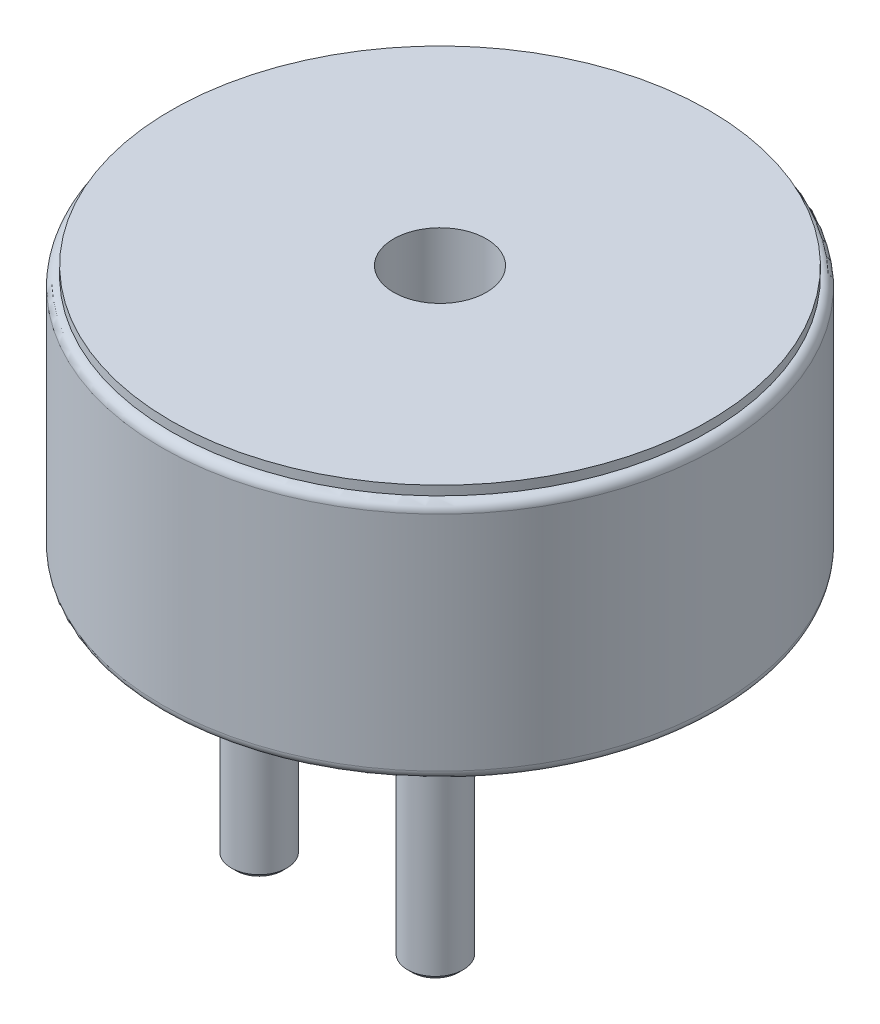
ISO-10303-21;
HEADER;
FILE_DESCRIPTION(('STEP AP214'),'2;1');
FILE_NAME('part.step','',(''),(''),'','','');
FILE_SCHEMA(('AUTOMOTIVE_DESIGN { 1 0 10303 214 1 1 1 1 }'));
ENDSEC;
DATA;
#1=APPLICATION_CONTEXT('core data for automotive mechanical design processes');
#2=APPLICATION_PROTOCOL_DEFINITION('international standard','automotive_design',2000,#1);
#3=PRODUCT_CONTEXT('',#1,'mechanical');
#4=PRODUCT('Part','Part','',(#3));
#5=PRODUCT_RELATED_PRODUCT_CATEGORY('part','',(#4));
#6=PRODUCT_DEFINITION_FORMATION('','',#4);
#7=PRODUCT_DEFINITION_CONTEXT('part definition',#1,'design');
#8=PRODUCT_DEFINITION('design','',#6,#7);
#9=PRODUCT_DEFINITION_SHAPE('','',#8);
#10=(LENGTH_UNIT() NAMED_UNIT(*) SI_UNIT(.MILLI.,.METRE.));
#11=(NAMED_UNIT(*) PLANE_ANGLE_UNIT() SI_UNIT($,.RADIAN.));
#12=(NAMED_UNIT(*) SI_UNIT($,.STERADIAN.) SOLID_ANGLE_UNIT());
#13=UNCERTAINTY_MEASURE_WITH_UNIT(LENGTH_MEASURE(1.E-05),#10,'distance_accuracy_value','');
#14=(GEOMETRIC_REPRESENTATION_CONTEXT(3) GLOBAL_UNCERTAINTY_ASSIGNED_CONTEXT((#13)) GLOBAL_UNIT_ASSIGNED_CONTEXT((#10,
#11,#12)) REPRESENTATION_CONTEXT('',''));
#15=CARTESIAN_POINT('',(0.,0.,0.));
#16=DIRECTION('',(0.,0.,1.));
#17=DIRECTION('',(1.,0.,0.));
#18=AXIS2_PLACEMENT_3D('',#15,#16,#17);
#19=CARTESIAN_POINT('',(0.,0.,0.));
#20=DIRECTION('',(0.,1.,0.));
#21=DIRECTION('',(0.,0.,1.));
#22=AXIS2_PLACEMENT_3D('',#19,#20,#21);
#23=PLANE('',#22);
#24=CARTESIAN_POINT('',(-0.95,0.,1.));
#25=DIRECTION('',(0.,1.,0.));
#26=DIRECTION('',(0.,0.,1.));
#27=AXIS2_PLACEMENT_3D('',#24,#25,#26);
#28=CIRCLE('',#27,0.3);
#29=CARTESIAN_POINT('',(-0.95,0.,1.3));
#30=VERTEX_POINT('',#29);
#31=EDGE_CURVE('E54',#30,#30,#28,.F.);
#32=ORIENTED_EDGE('',*,*,#31,.F.);
#33=EDGE_LOOP('',(#32));
#34=FACE_BOUND('',#33,.T.);
#35=CARTESIAN_POINT('',(0.,0.,0.));
#36=DIRECTION('',(0.,1.,0.));
#37=DIRECTION('',(0.,0.,1.));
#38=AXIS2_PLACEMENT_3D('',#35,#36,#37);
#39=CIRCLE('',#38,2.9);
#40=CARTESIAN_POINT('',(0.,0.,2.9));
#41=VERTEX_POINT('',#40);
#42=EDGE_CURVE('E57',#41,#41,#39,.F.);
#43=ORIENTED_EDGE('',*,*,#42,.T.);
#44=EDGE_LOOP('',(#43));
#45=FACE_BOUND('',#44,.T.);
#46=CARTESIAN_POINT('',(0.95,0.,1.));
#47=DIRECTION('',(0.,1.,0.));
#48=DIRECTION('',(0.,0.,1.));
#49=AXIS2_PLACEMENT_3D('',#46,#47,#48);
#50=CIRCLE('',#49,0.3);
#51=CARTESIAN_POINT('',(0.95,0.,1.3));
#52=VERTEX_POINT('',#51);
#53=EDGE_CURVE('E51',#52,#52,#50,.F.);
#54=ORIENTED_EDGE('',*,*,#53,.F.);
#55=EDGE_LOOP('',(#54));
#56=FACE_BOUND('',#55,.T.);
#57=ADVANCED_FACE('F31',(#34,#45,#56),#23,.F.);
#58=CARTESIAN_POINT('',(0.,2.6,0.));
#59=DIRECTION('',(0.,-1.,0.));
#60=DIRECTION('',(0.,0.,-1.));
#61=AXIS2_PLACEMENT_3D('',#58,#59,#60);
#62=CYLINDRICAL_SURFACE('',#61,3.);
#63=CARTESIAN_POINT('',(0.,2.5,0.));
#64=DIRECTION('',(0.,1.,0.));
#65=DIRECTION('',(0.,0.,1.));
#66=AXIS2_PLACEMENT_3D('',#63,#64,#65);
#67=CIRCLE('',#66,3.);
#68=CARTESIAN_POINT('',(0.,2.5,3.));
#69=VERTEX_POINT('',#68);
#70=EDGE_CURVE('E60',#69,#69,#67,.F.);
#71=ORIENTED_EDGE('',*,*,#70,.T.);
#72=EDGE_LOOP('',(#71));
#73=FACE_BOUND('',#72,.T.);
#74=CARTESIAN_POINT('',(0.,0.0999999999999998,0.));
#75=DIRECTION('',(0.,1.,0.));
#76=DIRECTION('',(0.,0.,1.));
#77=AXIS2_PLACEMENT_3D('',#74,#75,#76);
#78=CIRCLE('',#77,3.);
#79=CARTESIAN_POINT('',(0.,0.0999999999999998,3.));
#80=VERTEX_POINT('',#79);
#81=EDGE_CURVE('E63',#80,#80,#78,.T.);
#82=ORIENTED_EDGE('',*,*,#81,.T.);
#83=EDGE_LOOP('',(#82));
#84=FACE_BOUND('',#83,.T.);
#85=ADVANCED_FACE('F102',(#73,#84),#62,.T.);
#86=CARTESIAN_POINT('',(0.,2.5,0.));
#87=DIRECTION('',(0.,1.,0.));
#88=DIRECTION('',(0.,0.,1.));
#89=AXIS2_PLACEMENT_3D('',#86,#87,#88);
#90=TOROIDAL_SURFACE('',#89,2.9,0.1);
#91=ORIENTED_EDGE('',*,*,#70,.F.);
#92=EDGE_LOOP('',(#91));
#93=FACE_BOUND('',#92,.T.);
#94=CARTESIAN_POINT('',(0.,2.6,0.));
#95=DIRECTION('',(0.,1.,0.));
#96=DIRECTION('',(0.,0.,1.));
#97=AXIS2_PLACEMENT_3D('',#94,#95,#96);
#98=CIRCLE('',#97,2.9);
#99=CARTESIAN_POINT('',(0.,2.6,2.9));
#100=VERTEX_POINT('',#99);
#101=EDGE_CURVE('E66',#100,#100,#98,.T.);
#102=ORIENTED_EDGE('',*,*,#101,.F.);
#103=EDGE_LOOP('',(#102));
#104=FACE_BOUND('',#103,.T.);
#105=ADVANCED_FACE('F100',(#93,#104),#90,.T.);
#106=CARTESIAN_POINT('',(0.,0.0999999999999998,0.));
#107=DIRECTION('',(0.,1.,0.));
#108=DIRECTION('',(0.,0.,1.));
#109=AXIS2_PLACEMENT_3D('',#106,#107,#108);
#110=TOROIDAL_SURFACE('',#109,2.9,0.1);
#111=ORIENTED_EDGE('',*,*,#42,.F.);
#112=EDGE_LOOP('',(#111));
#113=FACE_BOUND('',#112,.T.);
#114=ORIENTED_EDGE('',*,*,#81,.F.);
#115=EDGE_LOOP('',(#114));
#116=FACE_BOUND('',#115,.T.);
#117=ADVANCED_FACE('F96',(#113,#116),#110,.T.);
#118=CARTESIAN_POINT('',(0.,2.7,0.));
#119=DIRECTION('',(0.,-1.,0.));
#120=DIRECTION('',(0.,0.,-1.));
#121=AXIS2_PLACEMENT_3D('',#118,#119,#120);
#122=CYLINDRICAL_SURFACE('',#121,2.9);
#123=CARTESIAN_POINT('',(0.,2.7,0.));
#124=DIRECTION('',(0.,1.,0.));
#125=DIRECTION('',(0.,0.,1.));
#126=AXIS2_PLACEMENT_3D('',#123,#124,#125);
#127=CIRCLE('',#126,2.9);
#128=CARTESIAN_POINT('',(0.,2.7,2.9));
#129=VERTEX_POINT('',#128);
#130=EDGE_CURVE('E69',#129,#129,#127,.T.);
#131=ORIENTED_EDGE('',*,*,#130,.F.);
#132=EDGE_LOOP('',(#131));
#133=FACE_BOUND('',#132,.T.);
#134=ORIENTED_EDGE('',*,*,#101,.T.);
#135=EDGE_LOOP('',(#134));
#136=FACE_BOUND('',#135,.T.);
#137=ADVANCED_FACE('F90',(#133,#136),#122,.T.);
#138=CARTESIAN_POINT('',(0.,2.7,0.));
#139=DIRECTION('',(0.,1.,0.));
#140=DIRECTION('',(0.,0.,1.));
#141=AXIS2_PLACEMENT_3D('',#138,#139,#140);
#142=PLANE('',#141);
#143=CARTESIAN_POINT('',(0.,2.7,0.));
#144=DIRECTION('',(0.,1.,0.));
#145=DIRECTION('',(0.,0.,1.));
#146=AXIS2_PLACEMENT_3D('',#143,#144,#145);
#147=CIRCLE('',#146,0.5);
#148=CARTESIAN_POINT('',(0.,2.7,0.5));
#149=VERTEX_POINT('',#148);
#150=EDGE_CURVE('E73',#149,#149,#147,.T.);
#151=ORIENTED_EDGE('',*,*,#150,.F.);
#152=EDGE_LOOP('',(#151));
#153=FACE_BOUND('',#152,.T.);
#154=ORIENTED_EDGE('',*,*,#130,.T.);
#155=EDGE_LOOP('',(#154));
#156=FACE_BOUND('',#155,.T.);
#157=ADVANCED_FACE('F84',(#153,#156),#142,.T.);
#158=CARTESIAN_POINT('',(0.,1.7,0.));
#159=DIRECTION('',(0.,1.,0.));
#160=DIRECTION('',(0.,0.,1.));
#161=AXIS2_PLACEMENT_3D('',#158,#159,#160);
#162=CYLINDRICAL_SURFACE('',#161,0.5);
#163=CARTESIAN_POINT('',(0.,1.7,0.));
#164=DIRECTION('',(0.,1.,0.));
#165=DIRECTION('',(0.,0.,1.));
#166=AXIS2_PLACEMENT_3D('',#163,#164,#165);
#167=CIRCLE('',#166,0.5);
#168=CARTESIAN_POINT('',(0.,1.7,0.5));
#169=VERTEX_POINT('',#168);
#170=EDGE_CURVE('E72',#169,#169,#167,.T.);
#171=ORIENTED_EDGE('',*,*,#170,.F.);
#172=EDGE_LOOP('',(#171));
#173=FACE_BOUND('',#172,.T.);
#174=ORIENTED_EDGE('',*,*,#150,.T.);
#175=EDGE_LOOP('',(#174));
#176=FACE_BOUND('',#175,.T.);
#177=ADVANCED_FACE('F81',(#173,#176),#162,.F.);
#178=CARTESIAN_POINT('',(0.,1.7,0.));
#179=DIRECTION('',(0.,1.,0.));
#180=DIRECTION('',(0.,0.,1.));
#181=AXIS2_PLACEMENT_3D('',#178,#179,#180);
#182=PLANE('',#181);
#183=ORIENTED_EDGE('',*,*,#170,.T.);
#184=EDGE_LOOP('',(#183));
#185=FACE_BOUND('',#184,.T.);
#186=ADVANCED_FACE('F79',(#185),#182,.T.);
#187=CARTESIAN_POINT('',(-0.95,-2.8,1.));
#188=DIRECTION('',(0.,1.,0.));
#189=DIRECTION('',(0.,0.,1.));
#190=AXIS2_PLACEMENT_3D('',#187,#188,#189);
#191=CYLINDRICAL_SURFACE('',#190,0.3);
#192=CARTESIAN_POINT('',(-0.95,-2.75,1.));
#193=DIRECTION('',(0.,-1.,0.));
#194=DIRECTION('',(0.,0.,-1.));
#195=AXIS2_PLACEMENT_3D('',#192,#193,#194);
#196=CIRCLE('',#195,0.3);
#197=CARTESIAN_POINT('',(-0.95,-2.75,0.7));
#198=VERTEX_POINT('',#197);
#199=EDGE_CURVE('E10',#198,#198,#196,.F.);
#200=ORIENTED_EDGE('',*,*,#199,.T.);
#201=EDGE_LOOP('',(#200));
#202=FACE_BOUND('',#201,.T.);
#203=ORIENTED_EDGE('',*,*,#31,.T.);
#204=EDGE_LOOP('',(#203));
#205=FACE_BOUND('',#204,.T.);
#206=ADVANCED_FACE('F124',(#202,#205),#191,.T.);
#207=CARTESIAN_POINT('',(-0.95,-2.8,1.));
#208=DIRECTION('',(0.,-1.,0.));
#209=DIRECTION('',(0.,0.,-1.));
#210=AXIS2_PLACEMENT_3D('',#207,#208,#209);
#211=PLANE('',#210);
#212=CARTESIAN_POINT('',(-0.95,-2.8,1.));
#213=DIRECTION('',(0.,-1.,0.));
#214=DIRECTION('',(0.,0.,-1.));
#215=AXIS2_PLACEMENT_3D('',#212,#213,#214);
#216=CIRCLE('',#215,0.250000000000001);
#217=CARTESIAN_POINT('',(-0.95,-2.8,0.749999999999999));
#218=VERTEX_POINT('',#217);
#219=EDGE_CURVE('E38',#218,#218,#216,.T.);
#220=ORIENTED_EDGE('',*,*,#219,.T.);
#221=EDGE_LOOP('',(#220));
#222=FACE_BOUND('',#221,.T.);
#223=ADVANCED_FACE('F127',(#222),#211,.T.);
#224=CARTESIAN_POINT('',(0.95,-2.8,1.));
#225=DIRECTION('',(0.,1.,0.));
#226=DIRECTION('',(0.,0.,1.));
#227=AXIS2_PLACEMENT_3D('',#224,#225,#226);
#228=CYLINDRICAL_SURFACE('',#227,0.3);
#229=CARTESIAN_POINT('',(0.95,-2.75,1.));
#230=DIRECTION('',(0.,1.,0.));
#231=DIRECTION('',(0.,0.,1.));
#232=AXIS2_PLACEMENT_3D('',#229,#230,#231);
#233=CIRCLE('',#232,0.3);
#234=CARTESIAN_POINT('',(0.95,-2.75,1.3));
#235=VERTEX_POINT('',#234);
#236=EDGE_CURVE('E42',#235,#235,#233,.T.);
#237=ORIENTED_EDGE('',*,*,#236,.T.);
#238=EDGE_LOOP('',(#237));
#239=FACE_BOUND('',#238,.T.);
#240=ORIENTED_EDGE('',*,*,#53,.T.);
#241=EDGE_LOOP('',(#240));
#242=FACE_BOUND('',#241,.T.);
#243=ADVANCED_FACE('F130',(#239,#242),#228,.T.);
#244=CARTESIAN_POINT('',(0.95,-2.8,1.));
#245=DIRECTION('',(0.,1.,0.));
#246=DIRECTION('',(0.,0.,1.));
#247=AXIS2_PLACEMENT_3D('',#244,#245,#246);
#248=PLANE('',#247);
#249=CARTESIAN_POINT('',(0.95,-2.8,1.));
#250=DIRECTION('',(0.,1.,0.));
#251=DIRECTION('',(0.,0.,1.));
#252=AXIS2_PLACEMENT_3D('',#249,#250,#251);
#253=CIRCLE('',#252,0.250000000000001);
#254=CARTESIAN_POINT('',(0.95,-2.8,1.25));
#255=VERTEX_POINT('',#254);
#256=EDGE_CURVE('E46',#255,#255,#253,.F.);
#257=ORIENTED_EDGE('',*,*,#256,.T.);
#258=EDGE_LOOP('',(#257));
#259=FACE_BOUND('',#258,.T.);
#260=ADVANCED_FACE('F133',(#259),#248,.F.);
#261=CARTESIAN_POINT('',(0.95,-2.8,1.));
#262=DIRECTION('',(0.,1.,0.));
#263=DIRECTION('',(0.,0.,1.));
#264=AXIS2_PLACEMENT_3D('',#261,#262,#263);
#265=CONICAL_SURFACE('',#264,0.250000000000001,0.785398163397439);
#266=ORIENTED_EDGE('',*,*,#236,.F.);
#267=EDGE_LOOP('',(#266));
#268=FACE_BOUND('',#267,.T.);
#269=ORIENTED_EDGE('',*,*,#256,.F.);
#270=EDGE_LOOP('',(#269));
#271=FACE_BOUND('',#270,.T.);
#272=ADVANCED_FACE('F136',(#268,#271),#265,.T.);
#273=CARTESIAN_POINT('',(-0.95,-2.8,1.));
#274=DIRECTION('',(0.,1.,0.));
#275=DIRECTION('',(0.,0.,1.));
#276=AXIS2_PLACEMENT_3D('',#273,#274,#275);
#277=CONICAL_SURFACE('',#276,0.250000000000001,0.785398163397439);
#278=ORIENTED_EDGE('',*,*,#199,.F.);
#279=EDGE_LOOP('',(#278));
#280=FACE_BOUND('',#279,.T.);
#281=ORIENTED_EDGE('',*,*,#219,.F.);
#282=EDGE_LOOP('',(#281));
#283=FACE_BOUND('',#282,.T.);
#284=ADVANCED_FACE('F33',(#280,#283),#277,.T.);
#285=CLOSED_SHELL('',(#57,#85,#105,#117,#137,#157,#177,#186,#206,#223,#243,#260,#272,#284));
#286=MANIFOLD_SOLID_BREP('B2',#285);
#287=ADVANCED_BREP_SHAPE_REPRESENTATION('',(#18,#286),#14);
#288=SHAPE_DEFINITION_REPRESENTATION(#9,#287);
ENDSEC;
END-ISO-10303-21;
